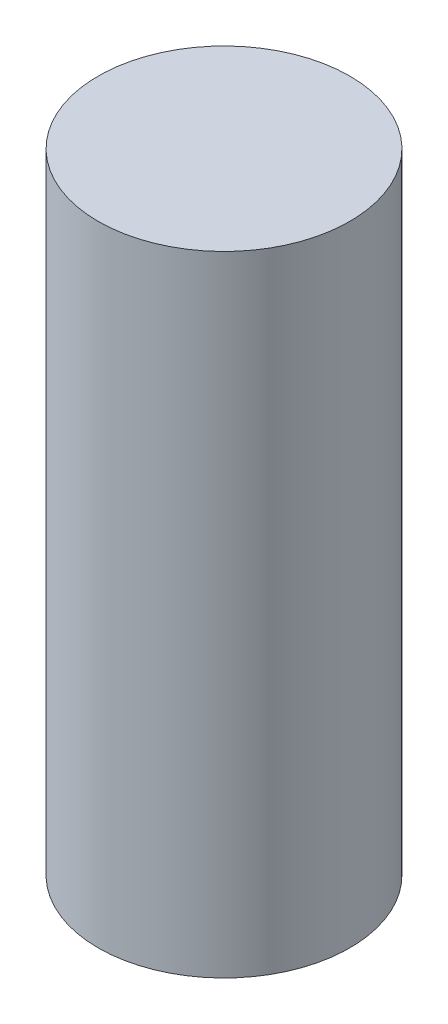
ISO-10303-21;
HEADER;
FILE_DESCRIPTION(('STEP AP214'),'2;1');
FILE_NAME('part.step','',(''),(''),'','','');
FILE_SCHEMA(('AUTOMOTIVE_DESIGN { 1 0 10303 214 1 1 1 1 }'));
ENDSEC;
DATA;
#1=APPLICATION_CONTEXT('core data for automotive mechanical design processes');
#2=APPLICATION_PROTOCOL_DEFINITION('international standard','automotive_design',2000,#1);
#3=PRODUCT_CONTEXT('',#1,'mechanical');
#4=PRODUCT('Part','Part','',(#3));
#5=PRODUCT_RELATED_PRODUCT_CATEGORY('part','',(#4));
#6=PRODUCT_DEFINITION_FORMATION('','',#4);
#7=PRODUCT_DEFINITION_CONTEXT('part definition',#1,'design');
#8=PRODUCT_DEFINITION('design','',#6,#7);
#9=PRODUCT_DEFINITION_SHAPE('','',#8);
#10=(LENGTH_UNIT() NAMED_UNIT(*) SI_UNIT(.MILLI.,.METRE.));
#11=(NAMED_UNIT(*) PLANE_ANGLE_UNIT() SI_UNIT($,.RADIAN.));
#12=(NAMED_UNIT(*) SI_UNIT($,.STERADIAN.) SOLID_ANGLE_UNIT());
#13=UNCERTAINTY_MEASURE_WITH_UNIT(LENGTH_MEASURE(1.E-05),#10,'distance_accuracy_value','');
#14=(GEOMETRIC_REPRESENTATION_CONTEXT(3) GLOBAL_UNCERTAINTY_ASSIGNED_CONTEXT((#13)) GLOBAL_UNIT_ASSIGNED_CONTEXT((#10,
#11,#12)) REPRESENTATION_CONTEXT('',''));
#15=CARTESIAN_POINT('',(0.,0.,0.));
#16=DIRECTION('',(0.,0.,1.));
#17=DIRECTION('',(1.,0.,0.));
#18=AXIS2_PLACEMENT_3D('',#15,#16,#17);
#19=CARTESIAN_POINT('',(0.,100.,0.));
#20=DIRECTION('',(0.,1.,0.));
#21=DIRECTION('',(0.,0.,1.));
#22=AXIS2_PLACEMENT_3D('',#19,#20,#21);
#23=PLANE('',#22);
#24=CARTESIAN_POINT('',(0.,100.,0.));
#25=DIRECTION('',(0.,-1.,0.));
#26=DIRECTION('',(0.,0.,-1.));
#27=AXIS2_PLACEMENT_3D('',#24,#25,#26);
#28=CIRCLE('',#27,20.);
#29=CARTESIAN_POINT('',(0.,100.,-20.));
#30=VERTEX_POINT('',#29);
#31=EDGE_CURVE('E10',#30,#30,#28,.T.);
#32=ORIENTED_EDGE('',*,*,#31,.F.);
#33=EDGE_LOOP('',(#32));
#34=FACE_BOUND('',#33,.T.);
#35=ADVANCED_FACE('F37',(#34),#23,.T.);
#36=CARTESIAN_POINT('',(0.,0.,0.));
#37=DIRECTION('',(0.,-1.,0.));
#38=DIRECTION('',(0.,0.,-1.));
#39=AXIS2_PLACEMENT_3D('',#36,#37,#38);
#40=CYLINDRICAL_SURFACE('',#39,20.);
#41=ORIENTED_EDGE('',*,*,#31,.T.);
#42=EDGE_LOOP('',(#41));
#43=FACE_BOUND('',#42,.T.);
#44=CARTESIAN_POINT('',(0.,0.,0.));
#45=DIRECTION('',(0.,-1.,0.));
#46=DIRECTION('',(0.,0.,-1.));
#47=AXIS2_PLACEMENT_3D('',#44,#45,#46);
#48=CIRCLE('',#47,20.);
#49=CARTESIAN_POINT('',(0.,0.,-20.));
#50=VERTEX_POINT('',#49);
#51=EDGE_CURVE('E43',#50,#50,#48,.T.);
#52=ORIENTED_EDGE('',*,*,#51,.F.);
#53=EDGE_LOOP('',(#52));
#54=FACE_BOUND('',#53,.T.);
#55=ADVANCED_FACE('F51',(#43,#54),#40,.T.);
#56=CARTESIAN_POINT('',(0.,0.,0.));
#57=DIRECTION('',(0.,-1.,0.));
#58=DIRECTION('',(0.,0.,-1.));
#59=AXIS2_PLACEMENT_3D('',#56,#57,#58);
#60=PLANE('',#59);
#61=ORIENTED_EDGE('',*,*,#51,.T.);
#62=EDGE_LOOP('',(#61));
#63=FACE_BOUND('',#62,.T.);
#64=ADVANCED_FACE('F49',(#63),#60,.T.);
#65=CLOSED_SHELL('',(#35,#55,#64));
#66=MANIFOLD_SOLID_BREP('B2',#65);
#67=ADVANCED_BREP_SHAPE_REPRESENTATION('',(#18,#66),#14);
#68=SHAPE_DEFINITION_REPRESENTATION(#9,#67);
ENDSEC;
END-ISO-10303-21;
